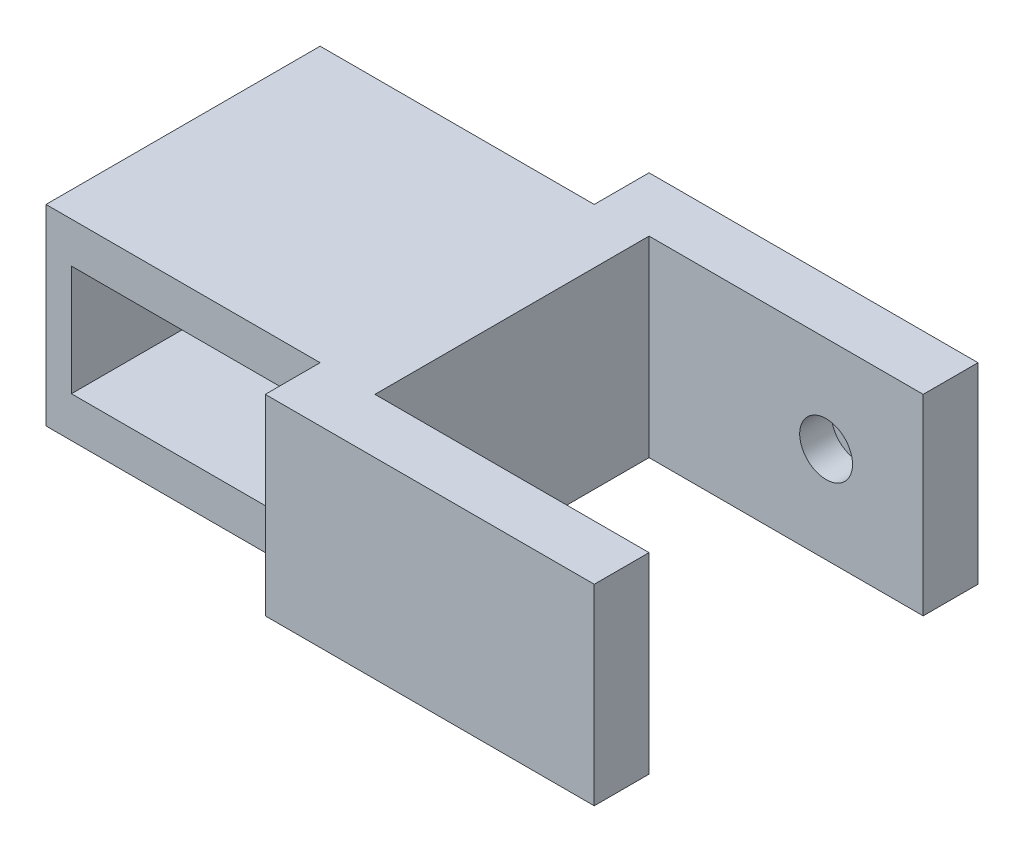
ISO-10303-21;
HEADER;
FILE_DESCRIPTION(('STEP AP214'),'2;1');
FILE_NAME('part.step','',(''),(''),'','','');
FILE_SCHEMA(('AUTOMOTIVE_DESIGN { 1 0 10303 214 1 1 1 1 }'));
ENDSEC;
DATA;
#1=APPLICATION_CONTEXT('core data for automotive mechanical design processes');
#2=APPLICATION_PROTOCOL_DEFINITION('international standard','automotive_design',2000,#1);
#3=PRODUCT_CONTEXT('',#1,'mechanical');
#4=PRODUCT('Part','Part','',(#3));
#5=PRODUCT_RELATED_PRODUCT_CATEGORY('part','',(#4));
#6=PRODUCT_DEFINITION_FORMATION('','',#4);
#7=PRODUCT_DEFINITION_CONTEXT('part definition',#1,'design');
#8=PRODUCT_DEFINITION('design','',#6,#7);
#9=PRODUCT_DEFINITION_SHAPE('','',#8);
#10=(LENGTH_UNIT() NAMED_UNIT(*) SI_UNIT(.MILLI.,.METRE.));
#11=(NAMED_UNIT(*) PLANE_ANGLE_UNIT() SI_UNIT($,.RADIAN.));
#12=(NAMED_UNIT(*) SI_UNIT($,.STERADIAN.) SOLID_ANGLE_UNIT());
#13=UNCERTAINTY_MEASURE_WITH_UNIT(LENGTH_MEASURE(1.E-05),#10,'distance_accuracy_value','');
#14=(GEOMETRIC_REPRESENTATION_CONTEXT(3) GLOBAL_UNCERTAINTY_ASSIGNED_CONTEXT((#13)) GLOBAL_UNIT_ASSIGNED_CONTEXT((#10,
#11,#12)) REPRESENTATION_CONTEXT('',''));
#15=CARTESIAN_POINT('',(0.,0.,0.));
#16=DIRECTION('',(0.,0.,1.));
#17=DIRECTION('',(1.,0.,0.));
#18=AXIS2_PLACEMENT_3D('',#15,#16,#17);
#19=CARTESIAN_POINT('',(-25.,17.5,50.));
#20=DIRECTION('',(0.,-1.,0.));
#21=DIRECTION('',(0.,0.,-1.));
#22=AXIS2_PLACEMENT_3D('',#19,#20,#21);
#23=PLANE('',#22);
#24=DIRECTION('',(-1.,0.,0.));
#25=VECTOR('',#24,1.);
#26=CARTESIAN_POINT('',(-25.,17.5,0.));
#27=LINE('',#26,#25);
#28=CARTESIAN_POINT('',(25.,17.5,0.));
#29=VERTEX_POINT('',#28);
#30=CARTESIAN_POINT('',(-25.,17.5,0.));
#31=VERTEX_POINT('',#30);
#32=EDGE_CURVE('E255',#29,#31,#27,.T.);
#33=ORIENTED_EDGE('',*,*,#32,.T.);
#34=DIRECTION('',(0.,0.,-1.));
#35=VECTOR('',#34,1.);
#36=CARTESIAN_POINT('',(-25.,17.5,50.));
#37=LINE('',#36,#35);
#38=CARTESIAN_POINT('',(-25.,17.5,50.));
#39=VERTEX_POINT('',#38);
#40=EDGE_CURVE('E11',#39,#31,#37,.T.);
#41=ORIENTED_EDGE('',*,*,#40,.F.);
#42=DIRECTION('',(-1.,0.,0.));
#43=VECTOR('',#42,1.);
#44=CARTESIAN_POINT('',(-25.,17.5,50.));
#45=LINE('',#44,#43);
#46=CARTESIAN_POINT('',(25.,17.5,50.));
#47=VERTEX_POINT('',#46);
#48=EDGE_CURVE('E157',#47,#39,#45,.T.);
#49=ORIENTED_EDGE('',*,*,#48,.F.);
#50=DIRECTION('',(0.,0.,1.));
#51=VECTOR('',#50,1.);
#52=CARTESIAN_POINT('',(25.,17.5,50.));
#53=LINE('',#52,#51);
#54=CARTESIAN_POINT('',(25.,17.5,60.));
#55=VERTEX_POINT('',#54);
#56=EDGE_CURVE('E76',#47,#55,#53,.T.);
#57=ORIENTED_EDGE('',*,*,#56,.T.);
#58=DIRECTION('',(1.,0.,0.));
#59=VECTOR('',#58,1.);
#60=CARTESIAN_POINT('',(85.,17.5,60.));
#61=LINE('',#60,#59);
#62=CARTESIAN_POINT('',(85.,17.5,60.));
#63=VERTEX_POINT('',#62);
#64=EDGE_CURVE('E155',#55,#63,#61,.T.);
#65=ORIENTED_EDGE('',*,*,#64,.T.);
#66=DIRECTION('',(0.,0.,-1.));
#67=VECTOR('',#66,1.);
#68=CARTESIAN_POINT('',(85.,17.5,50.));
#69=LINE('',#68,#67);
#70=CARTESIAN_POINT('',(85.,17.5,50.));
#71=VERTEX_POINT('',#70);
#72=EDGE_CURVE('E175',#63,#71,#69,.T.);
#73=ORIENTED_EDGE('',*,*,#72,.T.);
#74=DIRECTION('',(-1.,0.,0.));
#75=VECTOR('',#74,1.);
#76=CARTESIAN_POINT('',(35.,17.5,50.));
#77=LINE('',#76,#75);
#78=CARTESIAN_POINT('',(35.,17.5,50.));
#79=VERTEX_POINT('',#78);
#80=EDGE_CURVE('E178',#71,#79,#77,.T.);
#81=ORIENTED_EDGE('',*,*,#80,.T.);
#82=DIRECTION('',(0.,0.,-1.));
#83=VECTOR('',#82,1.);
#84=CARTESIAN_POINT('',(35.,17.5,50.));
#85=LINE('',#84,#83);
#86=CARTESIAN_POINT('',(35.,17.5,0.));
#87=VERTEX_POINT('',#86);
#88=EDGE_CURVE('E188',#79,#87,#85,.T.);
#89=ORIENTED_EDGE('',*,*,#88,.T.);
#90=DIRECTION('',(1.,0.,0.));
#91=VECTOR('',#90,1.);
#92=CARTESIAN_POINT('',(35.,17.5,0.));
#93=LINE('',#92,#91);
#94=CARTESIAN_POINT('',(85.,17.5,0.));
#95=VERTEX_POINT('',#94);
#96=EDGE_CURVE('E191',#87,#95,#93,.T.);
#97=ORIENTED_EDGE('',*,*,#96,.T.);
#98=DIRECTION('',(0.,0.,-1.));
#99=VECTOR('',#98,1.);
#100=CARTESIAN_POINT('',(85.,17.5,0.));
#101=LINE('',#100,#99);
#102=CARTESIAN_POINT('',(85.,17.5,-10.));
#103=VERTEX_POINT('',#102);
#104=EDGE_CURVE('E194',#95,#103,#101,.T.);
#105=ORIENTED_EDGE('',*,*,#104,.T.);
#106=DIRECTION('',(-1.,0.,0.));
#107=VECTOR('',#106,1.);
#108=CARTESIAN_POINT('',(85.,17.5,-10.));
#109=LINE('',#108,#107);
#110=CARTESIAN_POINT('',(25.,17.5,-9.99999999999999));
#111=VERTEX_POINT('',#110);
#112=EDGE_CURVE('E160',#103,#111,#109,.T.);
#113=ORIENTED_EDGE('',*,*,#112,.T.);
#114=EDGE_CURVE('E159',#111,#29,#53,.T.);
#115=ORIENTED_EDGE('',*,*,#114,.T.);
#116=EDGE_LOOP('',(#33,#41,#49,#57,#65,#73,#81,#89,#97,#105,#113,#115));
#117=FACE_BOUND('',#116,.T.);
#118=ADVANCED_FACE('F33',(#117),#23,.F.);
#119=CARTESIAN_POINT('',(-25.,17.5,50.));
#120=DIRECTION('',(1.,0.,0.));
#121=DIRECTION('',(0.,1.,0.));
#122=AXIS2_PLACEMENT_3D('',#119,#120,#121);
#123=PLANE('',#122);
#124=DIRECTION('',(0.,-1.,0.));
#125=VECTOR('',#124,1.);
#126=CARTESIAN_POINT('',(-25.,17.5,0.));
#127=LINE('',#126,#125);
#128=CARTESIAN_POINT('',(-25.,-17.5,0.));
#129=VERTEX_POINT('',#128);
#130=EDGE_CURVE('E69',#31,#129,#127,.T.);
#131=ORIENTED_EDGE('',*,*,#130,.T.);
#132=DIRECTION('',(0.,0.,-1.));
#133=VECTOR('',#132,1.);
#134=CARTESIAN_POINT('',(-25.,-17.5,50.));
#135=LINE('',#134,#133);
#136=CARTESIAN_POINT('',(-25.,-17.5,50.));
#137=VERTEX_POINT('',#136);
#138=EDGE_CURVE('E40',#137,#129,#135,.T.);
#139=ORIENTED_EDGE('',*,*,#138,.F.);
#140=DIRECTION('',(0.,-1.,0.));
#141=VECTOR('',#140,1.);
#142=CARTESIAN_POINT('',(-25.,17.5,50.));
#143=LINE('',#142,#141);
#144=EDGE_CURVE('E56',#39,#137,#143,.T.);
#145=ORIENTED_EDGE('',*,*,#144,.F.);
#146=ORIENTED_EDGE('',*,*,#40,.T.);
#147=EDGE_LOOP('',(#131,#139,#145,#146));
#148=FACE_BOUND('',#147,.T.);
#149=ADVANCED_FACE('F319',(#148),#123,.F.);
#150=CARTESIAN_POINT('',(-25.,-17.5,50.));
#151=DIRECTION('',(0.,1.,0.));
#152=DIRECTION('',(0.,0.,1.));
#153=AXIS2_PLACEMENT_3D('',#150,#151,#152);
#154=PLANE('',#153);
#155=DIRECTION('',(1.,0.,0.));
#156=VECTOR('',#155,1.);
#157=CARTESIAN_POINT('',(-25.,-17.5,0.));
#158=LINE('',#157,#156);
#159=CARTESIAN_POINT('',(25.,-17.5,0.));
#160=VERTEX_POINT('',#159);
#161=EDGE_CURVE('E249',#129,#160,#158,.T.);
#162=ORIENTED_EDGE('',*,*,#161,.T.);
#163=DIRECTION('',(0.,0.,-1.));
#164=VECTOR('',#163,1.);
#165=CARTESIAN_POINT('',(25.,-17.5,50.));
#166=LINE('',#165,#164);
#167=CARTESIAN_POINT('',(25.,-17.5,-9.99999999999999));
#168=VERTEX_POINT('',#167);
#169=EDGE_CURVE('E271',#160,#168,#166,.T.);
#170=ORIENTED_EDGE('',*,*,#169,.T.);
#171=DIRECTION('',(1.,0.,0.));
#172=VECTOR('',#171,1.);
#173=CARTESIAN_POINT('',(85.,-17.5,-10.));
#174=LINE('',#173,#172);
#175=CARTESIAN_POINT('',(85.,-17.5,-10.));
#176=VERTEX_POINT('',#175);
#177=EDGE_CURVE('E278',#168,#176,#174,.T.);
#178=ORIENTED_EDGE('',*,*,#177,.T.);
#179=DIRECTION('',(0.,0.,1.));
#180=VECTOR('',#179,1.);
#181=CARTESIAN_POINT('',(85.,-17.5,0.));
#182=LINE('',#181,#180);
#183=CARTESIAN_POINT('',(85.,-17.5,0.));
#184=VERTEX_POINT('',#183);
#185=EDGE_CURVE('E280',#176,#184,#182,.T.);
#186=ORIENTED_EDGE('',*,*,#185,.T.);
#187=DIRECTION('',(-1.,0.,0.));
#188=VECTOR('',#187,1.);
#189=CARTESIAN_POINT('',(35.,-17.5,0.));
#190=LINE('',#189,#188);
#191=CARTESIAN_POINT('',(35.,-17.5,0.));
#192=VERTEX_POINT('',#191);
#193=EDGE_CURVE('E281',#184,#192,#190,.T.);
#194=ORIENTED_EDGE('',*,*,#193,.T.);
#195=DIRECTION('',(0.,0.,1.));
#196=VECTOR('',#195,1.);
#197=CARTESIAN_POINT('',(35.,-17.5,50.));
#198=LINE('',#197,#196);
#199=CARTESIAN_POINT('',(35.,-17.5,50.));
#200=VERTEX_POINT('',#199);
#201=EDGE_CURVE('E285',#192,#200,#198,.T.);
#202=ORIENTED_EDGE('',*,*,#201,.T.);
#203=DIRECTION('',(1.,0.,0.));
#204=VECTOR('',#203,1.);
#205=CARTESIAN_POINT('',(35.,-17.5,50.));
#206=LINE('',#205,#204);
#207=CARTESIAN_POINT('',(85.,-17.5,50.));
#208=VERTEX_POINT('',#207);
#209=EDGE_CURVE('E287',#200,#208,#206,.T.);
#210=ORIENTED_EDGE('',*,*,#209,.T.);
#211=DIRECTION('',(0.,0.,1.));
#212=VECTOR('',#211,1.);
#213=CARTESIAN_POINT('',(85.,-17.5,50.));
#214=LINE('',#213,#212);
#215=CARTESIAN_POINT('',(85.,-17.5,60.));
#216=VERTEX_POINT('',#215);
#217=EDGE_CURVE('E202',#208,#216,#214,.T.);
#218=ORIENTED_EDGE('',*,*,#217,.T.);
#219=DIRECTION('',(-1.,0.,0.));
#220=VECTOR('',#219,1.);
#221=CARTESIAN_POINT('',(85.,-17.5,60.));
#222=LINE('',#221,#220);
#223=CARTESIAN_POINT('',(25.,-17.5,60.));
#224=VERTEX_POINT('',#223);
#225=EDGE_CURVE('E214',#216,#224,#222,.T.);
#226=ORIENTED_EDGE('',*,*,#225,.T.);
#227=CARTESIAN_POINT('',(25.,-17.5,50.));
#228=VERTEX_POINT('',#227);
#229=EDGE_CURVE('E167',#224,#228,#166,.T.);
#230=ORIENTED_EDGE('',*,*,#229,.T.);
#231=DIRECTION('',(1.,0.,0.));
#232=VECTOR('',#231,1.);
#233=CARTESIAN_POINT('',(-25.,-17.5,50.));
#234=LINE('',#233,#232);
#235=EDGE_CURVE('E252',#137,#228,#234,.T.);
#236=ORIENTED_EDGE('',*,*,#235,.F.);
#237=ORIENTED_EDGE('',*,*,#138,.T.);
#238=EDGE_LOOP('',(#162,#170,#178,#186,#194,#202,#210,#218,#226,#230,#236,#237));
#239=FACE_BOUND('',#238,.T.);
#240=ADVANCED_FACE('F262',(#239),#154,.F.);
#241=CARTESIAN_POINT('',(0.,0.,50.));
#242=DIRECTION('',(0.,0.,1.));
#243=DIRECTION('',(1.,0.,0.));
#244=AXIS2_PLACEMENT_3D('',#241,#242,#243);
#245=PLANE('',#244);
#246=DIRECTION('',(0.,1.,0.));
#247=VECTOR('',#246,1.);
#248=CARTESIAN_POINT('',(20.36,10.085,50.));
#249=LINE('',#248,#247);
#250=CARTESIAN_POINT('',(20.36,-10.085,50.));
#251=VERTEX_POINT('',#250);
#252=CARTESIAN_POINT('',(20.36,10.085,50.));
#253=VERTEX_POINT('',#252);
#254=EDGE_CURVE('E47',#251,#253,#249,.T.);
#255=ORIENTED_EDGE('',*,*,#254,.F.);
#256=DIRECTION('',(1.,0.,0.));
#257=VECTOR('',#256,1.);
#258=CARTESIAN_POINT('',(-20.36,-10.085,50.));
#259=LINE('',#258,#257);
#260=CARTESIAN_POINT('',(-20.36,-10.085,50.));
#261=VERTEX_POINT('',#260);
#262=EDGE_CURVE('E220',#261,#251,#259,.T.);
#263=ORIENTED_EDGE('',*,*,#262,.F.);
#264=DIRECTION('',(0.,-1.,0.));
#265=VECTOR('',#264,1.);
#266=CARTESIAN_POINT('',(-20.36,10.085,50.));
#267=LINE('',#266,#265);
#268=CARTESIAN_POINT('',(-20.36,10.085,50.));
#269=VERTEX_POINT('',#268);
#270=EDGE_CURVE('E234',#269,#261,#267,.T.);
#271=ORIENTED_EDGE('',*,*,#270,.F.);
#272=DIRECTION('',(-1.,0.,0.));
#273=VECTOR('',#272,1.);
#274=CARTESIAN_POINT('',(-20.36,10.085,50.));
#275=LINE('',#274,#273);
#276=EDGE_CURVE('E231',#253,#269,#275,.T.);
#277=ORIENTED_EDGE('',*,*,#276,.F.);
#278=EDGE_LOOP('',(#255,#263,#271,#277));
#279=FACE_BOUND('',#278,.T.);
#280=DIRECTION('',(0.,1.,0.));
#281=VECTOR('',#280,1.);
#282=CARTESIAN_POINT('',(25.,17.5,50.));
#283=LINE('',#282,#281);
#284=EDGE_CURVE('E247',#228,#47,#283,.T.);
#285=ORIENTED_EDGE('',*,*,#284,.T.);
#286=ORIENTED_EDGE('',*,*,#48,.T.);
#287=ORIENTED_EDGE('',*,*,#144,.T.);
#288=ORIENTED_EDGE('',*,*,#235,.T.);
#289=EDGE_LOOP('',(#285,#286,#287,#288));
#290=FACE_BOUND('',#289,.T.);
#291=ADVANCED_FACE('F318',(#279,#290),#245,.T.);
#292=CARTESIAN_POINT('',(0.,0.,0.));
#293=DIRECTION('',(0.,0.,1.));
#294=DIRECTION('',(1.,0.,0.));
#295=AXIS2_PLACEMENT_3D('',#292,#293,#294);
#296=PLANE('',#295);
#297=DIRECTION('',(0.,1.,0.));
#298=VECTOR('',#297,1.);
#299=CARTESIAN_POINT('',(25.,17.5,0.));
#300=LINE('',#299,#298);
#301=EDGE_CURVE('E241',#160,#29,#300,.T.);
#302=ORIENTED_EDGE('',*,*,#301,.F.);
#303=ORIENTED_EDGE('',*,*,#161,.F.);
#304=ORIENTED_EDGE('',*,*,#130,.F.);
#305=ORIENTED_EDGE('',*,*,#32,.F.);
#306=EDGE_LOOP('',(#302,#303,#304,#305));
#307=FACE_BOUND('',#306,.T.);
#308=ADVANCED_FACE('F265',(#307),#296,.F.);
#309=CARTESIAN_POINT('',(20.36,10.085,21.18));
#310=DIRECTION('',(1.,0.,0.));
#311=DIRECTION('',(0.,1.,0.));
#312=AXIS2_PLACEMENT_3D('',#309,#310,#311);
#313=PLANE('',#312);
#314=ORIENTED_EDGE('',*,*,#254,.T.);
#315=DIRECTION('',(0.,0.,1.));
#316=VECTOR('',#315,1.);
#317=CARTESIAN_POINT('',(20.36,10.085,21.18));
#318=LINE('',#317,#316);
#319=CARTESIAN_POINT('',(20.36,10.085,21.18));
#320=VERTEX_POINT('',#319);
#321=EDGE_CURVE('E229',#320,#253,#318,.T.);
#322=ORIENTED_EDGE('',*,*,#321,.F.);
#323=DIRECTION('',(0.,1.,0.));
#324=VECTOR('',#323,1.);
#325=CARTESIAN_POINT('',(20.36,10.085,21.18));
#326=LINE('',#325,#324);
#327=CARTESIAN_POINT('',(20.36,-10.085,21.18));
#328=VERTEX_POINT('',#327);
#329=EDGE_CURVE('E216',#328,#320,#326,.T.);
#330=ORIENTED_EDGE('',*,*,#329,.F.);
#331=DIRECTION('',(0.,0.,1.));
#332=VECTOR('',#331,1.);
#333=CARTESIAN_POINT('',(20.36,-10.085,21.18));
#334=LINE('',#333,#332);
#335=EDGE_CURVE('E239',#328,#251,#334,.T.);
#336=ORIENTED_EDGE('',*,*,#335,.T.);
#337=EDGE_LOOP('',(#314,#322,#330,#336));
#338=FACE_BOUND('',#337,.T.);
#339=ADVANCED_FACE('F329',(#338),#313,.F.);
#340=CARTESIAN_POINT('',(-20.36,-10.085,21.18));
#341=DIRECTION('',(0.,-1.,0.));
#342=DIRECTION('',(0.,0.,-1.));
#343=AXIS2_PLACEMENT_3D('',#340,#341,#342);
#344=PLANE('',#343);
#345=ORIENTED_EDGE('',*,*,#262,.T.);
#346=ORIENTED_EDGE('',*,*,#335,.F.);
#347=DIRECTION('',(1.,0.,0.));
#348=VECTOR('',#347,1.);
#349=CARTESIAN_POINT('',(-20.36,-10.085,21.18));
#350=LINE('',#349,#348);
#351=CARTESIAN_POINT('',(-20.36,-10.085,21.18));
#352=VERTEX_POINT('',#351);
#353=EDGE_CURVE('E226',#352,#328,#350,.T.);
#354=ORIENTED_EDGE('',*,*,#353,.F.);
#355=DIRECTION('',(0.,0.,1.));
#356=VECTOR('',#355,1.);
#357=CARTESIAN_POINT('',(-20.36,-10.085,21.18));
#358=LINE('',#357,#356);
#359=EDGE_CURVE('E242',#352,#261,#358,.T.);
#360=ORIENTED_EDGE('',*,*,#359,.T.);
#361=EDGE_LOOP('',(#345,#346,#354,#360));
#362=FACE_BOUND('',#361,.T.);
#363=ADVANCED_FACE('F335',(#362),#344,.F.);
#364=CARTESIAN_POINT('',(-20.36,10.085,21.18));
#365=DIRECTION('',(-1.,0.,0.));
#366=DIRECTION('',(0.,-1.,0.));
#367=AXIS2_PLACEMENT_3D('',#364,#365,#366);
#368=PLANE('',#367);
#369=ORIENTED_EDGE('',*,*,#270,.T.);
#370=ORIENTED_EDGE('',*,*,#359,.F.);
#371=DIRECTION('',(0.,-1.,0.));
#372=VECTOR('',#371,1.);
#373=CARTESIAN_POINT('',(-20.36,10.085,21.18));
#374=LINE('',#373,#372);
#375=CARTESIAN_POINT('',(-20.36,10.085,21.18));
#376=VERTEX_POINT('',#375);
#377=EDGE_CURVE('E223',#376,#352,#374,.T.);
#378=ORIENTED_EDGE('',*,*,#377,.F.);
#379=DIRECTION('',(0.,0.,1.));
#380=VECTOR('',#379,1.);
#381=CARTESIAN_POINT('',(-20.36,10.085,21.18));
#382=LINE('',#381,#380);
#383=EDGE_CURVE('E244',#376,#269,#382,.T.);
#384=ORIENTED_EDGE('',*,*,#383,.T.);
#385=EDGE_LOOP('',(#369,#370,#378,#384));
#386=FACE_BOUND('',#385,.T.);
#387=ADVANCED_FACE('F340',(#386),#368,.F.);
#388=CARTESIAN_POINT('',(-20.36,10.085,21.18));
#389=DIRECTION('',(0.,1.,0.));
#390=DIRECTION('',(0.,0.,1.));
#391=AXIS2_PLACEMENT_3D('',#388,#389,#390);
#392=PLANE('',#391);
#393=ORIENTED_EDGE('',*,*,#276,.T.);
#394=ORIENTED_EDGE('',*,*,#383,.F.);
#395=DIRECTION('',(-1.,0.,0.));
#396=VECTOR('',#395,1.);
#397=CARTESIAN_POINT('',(-20.36,10.085,21.18));
#398=LINE('',#397,#396);
#399=EDGE_CURVE('E219',#320,#376,#398,.T.);
#400=ORIENTED_EDGE('',*,*,#399,.F.);
#401=ORIENTED_EDGE('',*,*,#321,.T.);
#402=EDGE_LOOP('',(#393,#394,#400,#401));
#403=FACE_BOUND('',#402,.T.);
#404=ADVANCED_FACE('F336',(#403),#392,.F.);
#405=CARTESIAN_POINT('',(0.,0.,21.18));
#406=DIRECTION('',(0.,0.,1.));
#407=DIRECTION('',(1.,0.,0.));
#408=AXIS2_PLACEMENT_3D('',#405,#406,#407);
#409=PLANE('',#408);
#410=ORIENTED_EDGE('',*,*,#329,.T.);
#411=ORIENTED_EDGE('',*,*,#399,.T.);
#412=ORIENTED_EDGE('',*,*,#377,.T.);
#413=ORIENTED_EDGE('',*,*,#353,.T.);
#414=EDGE_LOOP('',(#410,#411,#412,#413));
#415=FACE_BOUND('',#414,.T.);
#416=ADVANCED_FACE('F339',(#415),#409,.T.);
#417=CARTESIAN_POINT('',(25.,-109.695444572929,50.));
#418=DIRECTION('',(-1.,0.,0.));
#419=DIRECTION('',(0.,0.,1.));
#420=AXIS2_PLACEMENT_3D('',#417,#418,#419);
#421=PLANE('',#420);
#422=ORIENTED_EDGE('',*,*,#284,.F.);
#423=ORIENTED_EDGE('',*,*,#229,.F.);
#424=DIRECTION('',(0.,1.,0.));
#425=VECTOR('',#424,1.);
#426=CARTESIAN_POINT('',(25.,-109.695444572929,60.));
#427=LINE('',#426,#425);
#428=EDGE_CURVE('E164',#224,#55,#427,.T.);
#429=ORIENTED_EDGE('',*,*,#428,.T.);
#430=ORIENTED_EDGE('',*,*,#56,.F.);
#431=EDGE_LOOP('',(#422,#423,#429,#430));
#432=FACE_BOUND('',#431,.T.);
#433=ADVANCED_FACE('F165',(#432),#421,.T.);
#434=ORIENTED_EDGE('',*,*,#169,.F.);
#435=ORIENTED_EDGE('',*,*,#301,.T.);
#436=ORIENTED_EDGE('',*,*,#114,.F.);
#437=DIRECTION('',(0.,1.,0.));
#438=VECTOR('',#437,1.);
#439=CARTESIAN_POINT('',(25.,-109.695444572929,-9.99999999999999));
#440=LINE('',#439,#438);
#441=EDGE_CURVE('E200',#168,#111,#440,.T.);
#442=ORIENTED_EDGE('',*,*,#441,.F.);
#443=EDGE_LOOP('',(#434,#435,#436,#442));
#444=FACE_BOUND('',#443,.T.);
#445=ADVANCED_FACE('F269',(#444),#421,.T.);
#446=CARTESIAN_POINT('',(85.,-109.695444572929,-10.));
#447=DIRECTION('',(0.,0.,-1.));
#448=DIRECTION('',(-1.,0.,0.));
#449=AXIS2_PLACEMENT_3D('',#446,#447,#448);
#450=PLANE('',#449);
#451=ORIENTED_EDGE('',*,*,#177,.F.);
#452=ORIENTED_EDGE('',*,*,#441,.T.);
#453=ORIENTED_EDGE('',*,*,#112,.F.);
#454=DIRECTION('',(0.,1.,0.));
#455=VECTOR('',#454,1.);
#456=CARTESIAN_POINT('',(85.,-109.695444572929,-10.));
#457=LINE('',#456,#455);
#458=EDGE_CURVE('E203',#176,#103,#457,.T.);
#459=ORIENTED_EDGE('',*,*,#458,.F.);
#460=EDGE_LOOP('',(#451,#452,#453,#459));
#461=FACE_BOUND('',#460,.T.);
#462=ADVANCED_FACE('F277',(#461),#450,.T.);
#463=CARTESIAN_POINT('',(85.,-109.695444572929,0.));
#464=DIRECTION('',(1.,0.,0.));
#465=DIRECTION('',(0.,0.,-1.));
#466=AXIS2_PLACEMENT_3D('',#463,#464,#465);
#467=PLANE('',#466);
#468=ORIENTED_EDGE('',*,*,#185,.F.);
#469=ORIENTED_EDGE('',*,*,#458,.T.);
#470=ORIENTED_EDGE('',*,*,#104,.F.);
#471=DIRECTION('',(0.,1.,0.));
#472=VECTOR('',#471,1.);
#473=CARTESIAN_POINT('',(85.,-109.695444572929,0.));
#474=LINE('',#473,#472);
#475=EDGE_CURVE('E205',#184,#95,#474,.T.);
#476=ORIENTED_EDGE('',*,*,#475,.F.);
#477=EDGE_LOOP('',(#468,#469,#470,#476));
#478=FACE_BOUND('',#477,.T.);
#479=ADVANCED_FACE('F299',(#478),#467,.T.);
#480=CARTESIAN_POINT('',(35.,-109.695444572929,0.));
#481=DIRECTION('',(0.,0.,1.));
#482=DIRECTION('',(1.,0.,0.));
#483=AXIS2_PLACEMENT_3D('',#480,#481,#482);
#484=PLANE('',#483);
#485=CARTESIAN_POINT('',(67.2941689669813,0.,0.));
#486=DIRECTION('',(0.,0.,1.));
#487=DIRECTION('',(1.,0.,0.));
#488=AXIS2_PLACEMENT_3D('',#485,#486,#487);
#489=CIRCLE('',#488,4.81725183621756);
#490=CARTESIAN_POINT('',(72.1114208031988,0.,0.));
#491=VERTEX_POINT('',#490);
#492=EDGE_CURVE('E181',#491,#491,#489,.T.);
#493=ORIENTED_EDGE('',*,*,#492,.F.);
#494=EDGE_LOOP('',(#493));
#495=FACE_BOUND('',#494,.T.);
#496=ORIENTED_EDGE('',*,*,#193,.F.);
#497=ORIENTED_EDGE('',*,*,#475,.T.);
#498=ORIENTED_EDGE('',*,*,#96,.F.);
#499=DIRECTION('',(0.,1.,0.));
#500=VECTOR('',#499,1.);
#501=CARTESIAN_POINT('',(35.,-109.695444572929,0.));
#502=LINE('',#501,#500);
#503=EDGE_CURVE('E207',#192,#87,#502,.T.);
#504=ORIENTED_EDGE('',*,*,#503,.F.);
#505=EDGE_LOOP('',(#496,#497,#498,#504));
#506=FACE_BOUND('',#505,.T.);
#507=ADVANCED_FACE('F295',(#495,#506),#484,.T.);
#508=CARTESIAN_POINT('',(35.,-109.695444572929,50.));
#509=DIRECTION('',(1.,0.,0.));
#510=DIRECTION('',(0.,0.,-1.));
#511=AXIS2_PLACEMENT_3D('',#508,#509,#510);
#512=PLANE('',#511);
#513=ORIENTED_EDGE('',*,*,#201,.F.);
#514=ORIENTED_EDGE('',*,*,#503,.T.);
#515=ORIENTED_EDGE('',*,*,#88,.F.);
#516=DIRECTION('',(0.,1.,0.));
#517=VECTOR('',#516,1.);
#518=CARTESIAN_POINT('',(35.,-109.695444572929,50.));
#519=LINE('',#518,#517);
#520=EDGE_CURVE('E209',#200,#79,#519,.T.);
#521=ORIENTED_EDGE('',*,*,#520,.F.);
#522=EDGE_LOOP('',(#513,#514,#515,#521));
#523=FACE_BOUND('',#522,.T.);
#524=ADVANCED_FACE('F298',(#523),#512,.T.);
#525=CARTESIAN_POINT('',(35.,-109.695444572929,50.));
#526=DIRECTION('',(0.,0.,-1.));
#527=DIRECTION('',(-1.,0.,0.));
#528=AXIS2_PLACEMENT_3D('',#525,#526,#527);
#529=PLANE('',#528);
#530=ORIENTED_EDGE('',*,*,#209,.F.);
#531=ORIENTED_EDGE('',*,*,#520,.T.);
#532=ORIENTED_EDGE('',*,*,#80,.F.);
#533=DIRECTION('',(0.,1.,0.));
#534=VECTOR('',#533,1.);
#535=CARTESIAN_POINT('',(85.,-109.695444572929,50.));
#536=LINE('',#535,#534);
#537=EDGE_CURVE('E211',#208,#71,#536,.T.);
#538=ORIENTED_EDGE('',*,*,#537,.F.);
#539=EDGE_LOOP('',(#530,#531,#532,#538));
#540=FACE_BOUND('',#539,.T.);
#541=ADVANCED_FACE('F315',(#540),#529,.T.);
#542=CARTESIAN_POINT('',(85.,-109.695444572929,50.));
#543=DIRECTION('',(1.,0.,0.));
#544=DIRECTION('',(0.,0.,-1.));
#545=AXIS2_PLACEMENT_3D('',#542,#543,#544);
#546=PLANE('',#545);
#547=ORIENTED_EDGE('',*,*,#217,.F.);
#548=ORIENTED_EDGE('',*,*,#537,.T.);
#549=ORIENTED_EDGE('',*,*,#72,.F.);
#550=DIRECTION('',(0.,1.,0.));
#551=VECTOR('',#550,1.);
#552=CARTESIAN_POINT('',(85.,-109.695444572929,60.));
#553=LINE('',#552,#551);
#554=EDGE_CURVE('E170',#216,#63,#553,.T.);
#555=ORIENTED_EDGE('',*,*,#554,.F.);
#556=EDGE_LOOP('',(#547,#548,#549,#555));
#557=FACE_BOUND('',#556,.T.);
#558=ADVANCED_FACE('F317',(#557),#546,.T.);
#559=CARTESIAN_POINT('',(85.,-109.695444572929,60.));
#560=DIRECTION('',(0.,0.,1.));
#561=DIRECTION('',(1.,0.,0.));
#562=AXIS2_PLACEMENT_3D('',#559,#560,#561);
#563=PLANE('',#562);
#564=ORIENTED_EDGE('',*,*,#225,.F.);
#565=ORIENTED_EDGE('',*,*,#554,.T.);
#566=ORIENTED_EDGE('',*,*,#64,.F.);
#567=ORIENTED_EDGE('',*,*,#428,.F.);
#568=EDGE_LOOP('',(#564,#565,#566,#567));
#569=FACE_BOUND('',#568,.T.);
#570=ADVANCED_FACE('F172',(#569),#563,.T.);
#571=CARTESIAN_POINT('',(67.2941689669813,0.,-5.81999999999999));
#572=DIRECTION('',(0.,0.,1.));
#573=DIRECTION('',(1.,0.,0.));
#574=AXIS2_PLACEMENT_3D('',#571,#572,#573);
#575=CYLINDRICAL_SURFACE('',#574,4.81725183621756);
#576=CARTESIAN_POINT('',(67.2941689669813,0.,-5.81999999999999));
#577=DIRECTION('',(0.,0.,1.));
#578=DIRECTION('',(1.,0.,0.));
#579=AXIS2_PLACEMENT_3D('',#576,#577,#578);
#580=CIRCLE('',#579,4.81725183621756);
#581=CARTESIAN_POINT('',(72.1114208031988,0.,-5.81999999999999));
#582=VERTEX_POINT('',#581);
#583=EDGE_CURVE('E176',#582,#582,#580,.T.);
#584=ORIENTED_EDGE('',*,*,#583,.F.);
#585=EDGE_LOOP('',(#584));
#586=FACE_BOUND('',#585,.T.);
#587=ORIENTED_EDGE('',*,*,#492,.T.);
#588=EDGE_LOOP('',(#587));
#589=FACE_BOUND('',#588,.T.);
#590=ADVANCED_FACE('F293',(#586,#589),#575,.F.);
#591=CARTESIAN_POINT('',(67.2941689669813,0.,-5.81999999999999));
#592=DIRECTION('',(0.,0.,1.));
#593=DIRECTION('',(1.,0.,0.));
#594=AXIS2_PLACEMENT_3D('',#591,#592,#593);
#595=PLANE('',#594);
#596=ORIENTED_EDGE('',*,*,#583,.T.);
#597=EDGE_LOOP('',(#596));
#598=FACE_BOUND('',#597,.T.);
#599=ADVANCED_FACE('F367',(#598),#595,.T.);
#600=CLOSED_SHELL('',(#118,#149,#240,#291,#308,#339,#363,#387,#404,#416,#433,#445,#462,#479,
#507,#524,#541,#558,#570,#590,#599));
#601=MANIFOLD_SOLID_BREP('B2',#600);
#602=ADVANCED_BREP_SHAPE_REPRESENTATION('',(#18,#601),#14);
#603=SHAPE_DEFINITION_REPRESENTATION(#9,#602);
ENDSEC;
END-ISO-10303-21;
